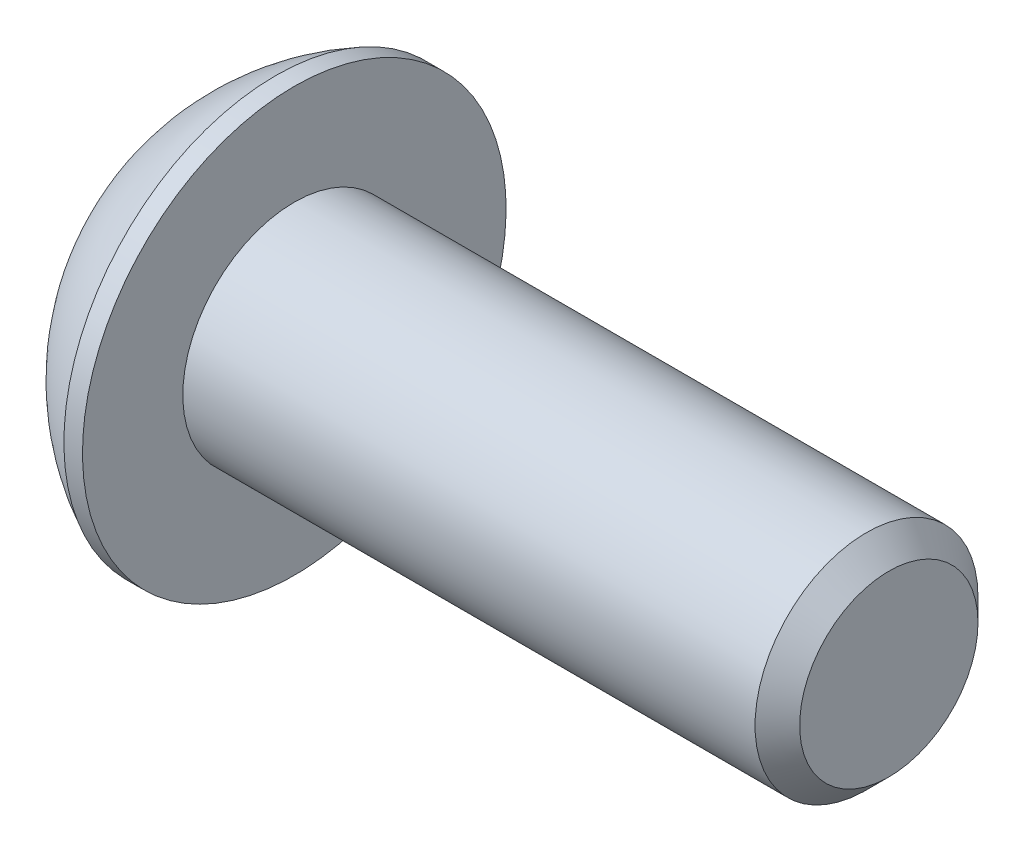
ISO-10303-21;
HEADER;
FILE_DESCRIPTION(('STEP AP214'),'2;1');
FILE_NAME('part.step','',(''),(''),'','','');
FILE_SCHEMA(('AUTOMOTIVE_DESIGN { 1 0 10303 214 1 1 1 1 }'));
ENDSEC;
DATA;
#1=APPLICATION_CONTEXT('core data for automotive mechanical design processes');
#2=APPLICATION_PROTOCOL_DEFINITION('international standard','automotive_design',2000,#1);
#3=PRODUCT_CONTEXT('',#1,'mechanical');
#4=PRODUCT('Part','Part','',(#3));
#5=PRODUCT_RELATED_PRODUCT_CATEGORY('part','',(#4));
#6=PRODUCT_DEFINITION_FORMATION('','',#4);
#7=PRODUCT_DEFINITION_CONTEXT('part definition',#1,'design');
#8=PRODUCT_DEFINITION('design','',#6,#7);
#9=PRODUCT_DEFINITION_SHAPE('','',#8);
#10=(LENGTH_UNIT() NAMED_UNIT(*) SI_UNIT(.MILLI.,.METRE.));
#11=(NAMED_UNIT(*) PLANE_ANGLE_UNIT() SI_UNIT($,.RADIAN.));
#12=(NAMED_UNIT(*) SI_UNIT($,.STERADIAN.) SOLID_ANGLE_UNIT());
#13=UNCERTAINTY_MEASURE_WITH_UNIT(LENGTH_MEASURE(1.E-05),#10,'distance_accuracy_value','');
#14=(GEOMETRIC_REPRESENTATION_CONTEXT(3) GLOBAL_UNCERTAINTY_ASSIGNED_CONTEXT((#13)) GLOBAL_UNIT_ASSIGNED_CONTEXT((#10,
#11,#12)) REPRESENTATION_CONTEXT('',''));
#15=CARTESIAN_POINT('',(0.,0.,0.));
#16=DIRECTION('',(0.,0.,1.));
#17=DIRECTION('',(1.,0.,0.));
#18=AXIS2_PLACEMENT_3D('',#15,#16,#17);
#19=CARTESIAN_POINT('',(-8.,0.,0.));
#20=DIRECTION('',(1.,0.,0.));
#21=DIRECTION('',(0.,0.,-1.));
#22=AXIS2_PLACEMENT_3D('',#19,#20,#21);
#23=CYLINDRICAL_SURFACE('',#22,1.5);
#24=CARTESIAN_POINT('',(-0.3,0.,0.));
#25=DIRECTION('',(1.,0.,0.));
#26=DIRECTION('',(0.,0.,-1.));
#27=AXIS2_PLACEMENT_3D('',#24,#25,#26);
#28=CIRCLE('',#27,1.5);
#29=CARTESIAN_POINT('',(-0.3,0.,-1.5));
#30=VERTEX_POINT('',#29);
#31=EDGE_CURVE('E47',#30,#30,#28,.F.);
#32=ORIENTED_EDGE('',*,*,#31,.T.);
#33=EDGE_LOOP('',(#32));
#34=FACE_BOUND('',#33,.T.);
#35=CARTESIAN_POINT('',(-8.,0.,0.));
#36=DIRECTION('',(1.,0.,0.));
#37=DIRECTION('',(0.,1.,0.));
#38=AXIS2_PLACEMENT_3D('',#35,#36,#37);
#39=CIRCLE('',#38,1.5);
#40=CARTESIAN_POINT('',(-8.,1.49999999999999,0.));
#41=VERTEX_POINT('',#40);
#42=EDGE_CURVE('E126',#41,#41,#39,.F.);
#43=ORIENTED_EDGE('',*,*,#42,.F.);
#44=EDGE_LOOP('',(#43));
#45=FACE_BOUND('',#44,.T.);
#46=ADVANCED_FACE('F33',(#34,#45),#23,.T.);
#47=CARTESIAN_POINT('',(0.,0.,0.));
#48=DIRECTION('',(1.,0.,0.));
#49=DIRECTION('',(0.,0.,-1.));
#50=AXIS2_PLACEMENT_3D('',#47,#48,#49);
#51=PLANE('',#50);
#52=CARTESIAN_POINT('',(0.,0.,0.));
#53=DIRECTION('',(1.,0.,0.));
#54=DIRECTION('',(0.,0.,-1.));
#55=AXIS2_PLACEMENT_3D('',#52,#53,#54);
#56=CIRCLE('',#55,1.2);
#57=CARTESIAN_POINT('',(0.,0.,-1.2));
#58=VERTEX_POINT('',#57);
#59=EDGE_CURVE('E129',#58,#58,#56,.T.);
#60=ORIENTED_EDGE('',*,*,#59,.T.);
#61=EDGE_LOOP('',(#60));
#62=FACE_BOUND('',#61,.T.);
#63=ADVANCED_FACE('F139',(#62),#51,.T.);
#64=CARTESIAN_POINT('',(0.,0.,0.));
#65=DIRECTION('',(-1.,0.,0.));
#66=DIRECTION('',(0.,0.,1.));
#67=AXIS2_PLACEMENT_3D('',#64,#65,#66);
#68=CONICAL_SURFACE('',#67,1.2,0.785398163397447);
#69=ORIENTED_EDGE('',*,*,#31,.F.);
#70=EDGE_LOOP('',(#69));
#71=FACE_BOUND('',#70,.T.);
#72=ORIENTED_EDGE('',*,*,#59,.F.);
#73=EDGE_LOOP('',(#72));
#74=FACE_BOUND('',#73,.T.);
#75=ADVANCED_FACE('F35',(#71,#74),#68,.T.);
#76=CARTESIAN_POINT('',(-9.65,0.,0.));
#77=DIRECTION('',(-1.,0.,0.));
#78=DIRECTION('',(0.,-1.,0.));
#79=AXIS2_PLACEMENT_3D('',#76,#77,#78);
#80=PLANE('',#79);
#81=CARTESIAN_POINT('',(-9.65,0.,0.));
#82=DIRECTION('',(-1.,0.,0.));
#83=DIRECTION('',(0.,-1.,0.));
#84=AXIS2_PLACEMENT_3D('',#81,#82,#83);
#85=CIRCLE('',#84,1.20470053837925);
#86=CARTESIAN_POINT('',(-9.65,-1.20470053837926,0.));
#87=VERTEX_POINT('',#86);
#88=EDGE_CURVE('E248',#87,#87,#85,.T.);
#89=ORIENTED_EDGE('',*,*,#88,.F.);
#90=EDGE_LOOP('',(#89));
#91=FACE_BOUND('',#90,.T.);
#92=CARTESIAN_POINT('',(-9.65,0.,0.));
#93=DIRECTION('',(1.,0.,0.));
#94=DIRECTION('',(0.,1.,0.));
#95=AXIS2_PLACEMENT_3D('',#92,#93,#94);
#96=CIRCLE('',#95,1.5);
#97=CARTESIAN_POINT('',(-9.65,1.5,0.));
#98=VERTEX_POINT('',#97);
#99=EDGE_CURVE('E123',#98,#98,#96,.T.);
#100=ORIENTED_EDGE('',*,*,#99,.F.);
#101=EDGE_LOOP('',(#100));
#102=FACE_BOUND('',#101,.T.);
#103=ADVANCED_FACE('F138',(#91,#102),#80,.T.);
#104=CARTESIAN_POINT('',(-6.85267857142857,0.,0.));
#105=DIRECTION('',(1.,0.,0.));
#106=DIRECTION('',(0.,1.,0.));
#107=AXIS2_PLACEMENT_3D('',#104,#105,#106);
#108=SPHERICAL_SURFACE('',#107,3.17411517981703);
#109=CARTESIAN_POINT('',(-8.25,0.,0.));
#110=DIRECTION('',(1.,0.,0.));
#111=DIRECTION('',(0.,1.,0.));
#112=AXIS2_PLACEMENT_3D('',#109,#110,#111);
#113=CIRCLE('',#112,2.85);
#114=CARTESIAN_POINT('',(-8.25,2.85,0.));
#115=VERTEX_POINT('',#114);
#116=EDGE_CURVE('E120',#115,#115,#113,.T.);
#117=CARTESIAN_POINT('',(-9.65,1.5,0.));
#118=CARTESIAN_POINT('',(-9.64026970175371,1.51814590550861,0.));
#119=CARTESIAN_POINT('',(-9.63036279141013,1.53619710575443,0.));
#120=CARTESIAN_POINT('',(-9.61019960266953,1.57210331824231,0.));
#121=CARTESIAN_POINT('',(-9.59994332427251,1.58995833048437,0.));
#122=CARTESIAN_POINT('',(-9.57908525556619,1.62546538948657,0.));
#123=CARTESIAN_POINT('',(-9.56848346525689,1.64311743624671,0.));
#124=CARTESIAN_POINT('',(-9.54693839516577,1.67821188357876,0.));
#125=CARTESIAN_POINT('',(-9.53599511538396,1.69565428415069,0.));
#126=CARTESIAN_POINT('',(-9.51377120861204,1.73032283245973,0.));
#127=CARTESIAN_POINT('',(-9.50249058162193,1.74754898019686,0.));
#128=CARTESIAN_POINT('',(-9.47959625299793,1.78177849951501,0.));
#129=CARTESIAN_POINT('',(-9.46798255136403,1.79878187109604,0.));
#130=CARTESIAN_POINT('',(-9.44442647147186,1.8325593987641,0.));
#131=CARTESIAN_POINT('',(-9.4324840932136,1.84933355485112,0.));
#132=CARTESIAN_POINT('',(-9.40827518274626,1.88264629910089,0.));
#133=CARTESIAN_POINT('',(-9.39600865053719,1.89918488726362,0.));
#134=CARTESIAN_POINT('',(-9.37115607755147,1.93202023241769,0.));
#135=CARTESIAN_POINT('',(-9.35857003677481,1.94831698940902,0.));
#136=CARTESIAN_POINT('',(-9.33308321304966,1.98066250056315,0.));
#137=CARTESIAN_POINT('',(-9.32018243010117,1.99671125472595,0.));
#138=CARTESIAN_POINT('',(-9.29407100761891,2.02855468248373,0.));
#139=CARTESIAN_POINT('',(-9.28086036808515,2.04434935607872,0.));
#140=CARTESIAN_POINT('',(-9.25413423536401,2.07567864118366,0.));
#141=CARTESIAN_POINT('',(-9.24061874217664,2.09121325269361,0.));
#142=CARTESIAN_POINT('',(-9.21328802052923,2.12201653059784,0.));
#143=CARTESIAN_POINT('',(-9.19947279206918,2.13728519699211,0.));
#144=CARTESIAN_POINT('',(-9.17154783176855,2.16755080234906,0.));
#145=CARTESIAN_POINT('',(-9.15743809992798,2.18254774131173,0.));
#146=CARTESIAN_POINT('',(-9.12892947628826,2.21226421239399,0.));
#147=CARTESIAN_POINT('',(-9.11453058448912,2.22698374451358,0.));
#148=CARTESIAN_POINT('',(-9.08544909386046,2.25613982755347,0.));
#149=CARTESIAN_POINT('',(-9.07076649503095,2.27057637847377,0.));
#150=CARTESIAN_POINT('',(-9.04112315071093,2.29916103192521,0.));
#151=CARTESIAN_POINT('',(-9.02616240522044,2.31330913445635,0.));
#152=CARTESIAN_POINT('',(-8.9959684332833,2.34131153317633,0.));
#153=CARTESIAN_POINT('',(-8.98073520683666,2.35516582936518,0.));
#154=CARTESIAN_POINT('',(-8.95000204188189,2.38257536871332,0.));
#155=CARTESIAN_POINT('',(-8.93450210337377,2.3961306118726,0.));
#156=CARTESIAN_POINT('',(-8.90324138419582,2.42293691172714,0.));
#157=CARTESIAN_POINT('',(-8.88748060352599,2.43618796842238,0.));
#158=CARTESIAN_POINT('',(-8.85570416870656,2.46238087711119,0.));
#159=CARTESIAN_POINT('',(-8.83968851455696,2.47532272910475,0.));
#160=CARTESIAN_POINT('',(-8.80740839798172,2.50089232724988,0.));
#161=CARTESIAN_POINT('',(-8.79114393555609,2.51352007340145,0.));
#162=CARTESIAN_POINT('',(-8.75837236185728,2.53845667767541,0.));
#163=CARTESIAN_POINT('',(-8.74186525058411,2.55076553579779,0.));
#164=CARTESIAN_POINT('',(-8.70861463051145,2.57505970259155,0.));
#165=CARTESIAN_POINT('',(-8.69187112171197,2.58704501126291,0.));
#166=CARTESIAN_POINT('',(-8.65815404743097,2.61068754025891,0.));
#167=CARTESIAN_POINT('',(-8.64118048194944,2.62234476058354,0.));
#168=CARTESIAN_POINT('',(-8.60700972227902,2.64532669825233,0.));
#169=CARTESIAN_POINT('',(-8.58981252809013,2.65665141559648,0.));
#170=CARTESIAN_POINT('',(-8.55520102364322,2.6789640585411,0.));
#171=CARTESIAN_POINT('',(-8.5377867133852,2.68995198414157,0.));
#172=CARTESIAN_POINT('',(-8.50274757175707,2.71158688256655,0.));
#173=CARTESIAN_POINT('',(-8.48512274038695,2.72223385539107,0.));
#174=CARTESIAN_POINT('',(-8.44966923085904,2.74318281565687,0.));
#175=CARTESIAN_POINT('',(-8.43184055270124,2.75348480309814,0.));
#176=CARTESIAN_POINT('',(-8.39598610245597,2.7737398932333,0.));
#177=CARTESIAN_POINT('',(-8.37796033036851,2.78369299592719,0.));
#178=CARTESIAN_POINT('',(-8.34171851477686,2.8032465396409,0.));
#179=CARTESIAN_POINT('',(-8.32350247127267,2.81284698066071,0.));
#180=CARTESIAN_POINT('',(-8.28688702602323,2.83169159380608,0.));
#181=CARTESIAN_POINT('',(-8.26848762427797,2.84093576593165,0.));
#182=CARTESIAN_POINT('',(-8.25,2.85,0.));
#183=B_SPLINE_CURVE_WITH_KNOTS('',3,(#117,#118,#119,#120,#121,#122,#123,#124,#125,#126,#127,
#128,#129,#130,#131,#132,#133,#134,#135,#136,#137,#138,#139,#140,#141,#142,#143,#144,#145,#146,
#147,#148,#149,#150,#151,#152,#153,#154,#155,#156,#157,#158,#159,#160,#161,#162,#163,#164,#165,
#166,#167,#168,#169,#170,#171,#172,#173,#174,#175,#176,#177,#178,#179,#180,#181,#182),
.UNSPECIFIED.,.F.,.F.,(4,2,2,2,2,2,2,2,2,2,2,2,2,2,2,2,2,2,2,2,2,2,2,2,2,2,2,2,2,2,2,2,4),(0.,
0.0617693508858094,0.12353870177162,0.185308052657429,0.247077403543238,0.308846754429048,
0.370616105314857,0.432385456200667,0.494154807086476,0.555924157972285,0.617693508858095,
0.679462859743904,0.741232210629714,0.803001561515523,0.864770912401333,0.926540263287143,
0.988309614172951,1.05007896505876,1.11184831594457,1.17361766683038,1.23538701771619,
1.297156368602,1.35892571948781,1.42069507037362,1.48246442125943,1.54423377214524,
1.60600312303105,1.66777247391686,1.72954182480267,1.79131117568847,1.85308052657428,
1.91484987746009,1.9766192283459),.UNSPECIFIED.);
#184=EDGE_CURVE('BSEAM150',#98,#115,#183,.T.);
#185=ORIENTED_EDGE('',*,*,#99,.T.);
#186=ORIENTED_EDGE('',*,*,#116,.F.);
#187=ORIENTED_EDGE('',*,*,#184,.T.);
#188=ORIENTED_EDGE('',*,*,#184,.F.);
#189=EDGE_LOOP('',(#185,#187,#186,#188));
#190=FACE_BOUND('',#189,.T.);
#191=ADVANCED_FACE('F150',(#190),#108,.T.);
#192=CARTESIAN_POINT('',(-8.,0.,0.));
#193=DIRECTION('',(1.,0.,0.));
#194=DIRECTION('',(0.,1.,0.));
#195=AXIS2_PLACEMENT_3D('',#192,#193,#194);
#196=CYLINDRICAL_SURFACE('',#195,2.85);
#197=ORIENTED_EDGE('',*,*,#116,.T.);
#198=EDGE_LOOP('',(#197));
#199=FACE_BOUND('',#198,.T.);
#200=CARTESIAN_POINT('',(-8.,0.,0.));
#201=DIRECTION('',(1.,0.,0.));
#202=DIRECTION('',(0.,1.,0.));
#203=AXIS2_PLACEMENT_3D('',#200,#201,#202);
#204=CIRCLE('',#203,2.85);
#205=CARTESIAN_POINT('',(-8.,2.85,0.));
#206=VERTEX_POINT('',#205);
#207=EDGE_CURVE('E117',#206,#206,#204,.T.);
#208=ORIENTED_EDGE('',*,*,#207,.F.);
#209=EDGE_LOOP('',(#208));
#210=FACE_BOUND('',#209,.T.);
#211=ADVANCED_FACE('F154',(#199,#210),#196,.T.);
#212=CARTESIAN_POINT('',(-8.,2.85,0.));
#213=DIRECTION('',(1.,0.,0.));
#214=DIRECTION('',(0.,1.,0.));
#215=AXIS2_PLACEMENT_3D('',#212,#213,#214);
#216=PLANE('',#215);
#217=ORIENTED_EDGE('',*,*,#42,.T.);
#218=EDGE_LOOP('',(#217));
#219=FACE_BOUND('',#218,.T.);
#220=ORIENTED_EDGE('',*,*,#207,.T.);
#221=EDGE_LOOP('',(#220));
#222=FACE_BOUND('',#221,.T.);
#223=ADVANCED_FACE('F158',(#219,#222),#216,.T.);
#224=CARTESIAN_POINT('',(-9.65,0.,0.));
#225=DIRECTION('',(-1.,0.,0.));
#226=DIRECTION('',(0.,-1.,0.));
#227=AXIS2_PLACEMENT_3D('',#224,#225,#226);
#228=CONICAL_SURFACE('',#227,1.20470053837925,0.78539816339745);
#229=ORIENTED_EDGE('',*,*,#88,.T.);
#230=EDGE_LOOP('',(#229));
#231=FACE_BOUND('',#230,.T.);
#232=CARTESIAN_POINT('',(-10.0125645579163,-1.20678079288096,1.));
#233=CARTESIAN_POINT('',(-9.99012387997521,-1.17763239380938,1.));
#234=CARTESIAN_POINT('',(-9.96788676092706,-1.14832777655038,1.));
#235=CARTESIAN_POINT('',(-9.92390532308587,-1.0893407399734,1.));
#236=CARTESIAN_POINT('',(-9.90216112088704,-1.05965823380996,1.));
#237=CARTESIAN_POINT('',(-9.83748588022217,-0.969511619364379,1.));
#238=CARTESIAN_POINT('',(-9.79545644276499,-0.908390032886409,1.));
#239=CARTESIAN_POINT('',(-9.71242033491188,-0.779849899214034,1.));
#240=CARTESIAN_POINT('',(-9.67164849568708,-0.712278047733962,1.));
#241=CARTESIAN_POINT('',(-9.59670568554025,-0.573692441836179,1.));
#242=CARTESIAN_POINT('',(-9.56251242080363,-0.502691370033591,1.));
#243=CARTESIAN_POINT('',(-9.52066482404941,-0.396633108483669,1.));
#244=CARTESIAN_POINT('',(-9.50875242460105,-0.363265114723096,1.));
#245=CARTESIAN_POINT('',(-9.48760105808146,-0.295675144863693,1.));
#246=CARTESIAN_POINT('',(-9.47836226085427,-0.261453114661033,1.));
#247=CARTESIAN_POINT('',(-9.46321083759311,-0.192964714439427,1.));
#248=CARTESIAN_POINT('',(-9.45723720793528,-0.158712062702431,1.));
#249=CARTESIAN_POINT('',(-9.44873817928594,-0.0897678989597888,1.));
#250=CARTESIAN_POINT('',(-9.44621316916075,-0.0550763379077905,1.));
#251=CARTESIAN_POINT('',(-9.44483082423944,0.0128534343372017,1.));
#252=CARTESIAN_POINT('',(-9.44581713334252,0.0460884918414669,1.));
#253=CARTESIAN_POINT('',(-9.45104282964632,0.112288777523354,1.));
#254=CARTESIAN_POINT('',(-9.45528142282844,0.145254069576927,1.));
#255=CARTESIAN_POINT('',(-9.46684319323882,0.211252641710473,1.));
#256=CARTESIAN_POINT('',(-9.47422139919693,0.244276126106416,1.));
#257=CARTESIAN_POINT('',(-9.49165376330127,0.309593416178906,1.));
#258=CARTESIAN_POINT('',(-9.50170777209373,0.341887262472136,1.));
#259=CARTESIAN_POINT('',(-9.53646926761079,0.441188556116714,1.));
#260=CARTESIAN_POINT('',(-9.56503436033369,0.506841480843487,1.));
#261=CARTESIAN_POINT('',(-9.62860336942529,0.635081389212373,1.));
#262=CARTESIAN_POINT('',(-9.66362995530904,0.697656564069532,1.));
#263=CARTESIAN_POINT('',(-9.73595461078913,0.817274369694621,1.));
#264=CARTESIAN_POINT('',(-9.77305561629113,0.87443767231359,1.));
#265=CARTESIAN_POINT('',(-9.8304371678966,0.958655710303493,1.));
#266=CARTESIAN_POINT('',(-9.84977201892494,0.986366163766959,1.));
#267=CARTESIAN_POINT('',(-9.88896027138788,1.0414069197441,1.));
#268=CARTESIAN_POINT('',(-9.90881352920099,1.06873732439882,1.));
#269=CARTESIAN_POINT('',(-9.92888195229002,1.0959092145887,1.));
#270=B_SPLINE_CURVE_WITH_KNOTS('',3,(#232,#233,#234,#235,#236,#237,#238,#239,#240,#241,#242,
#243,#244,#245,#246,#247,#248,#249,#250,#251,#252,#253,#254,#255,#256,#257,#258,#259,#260,#261,
#262,#263,#264,#265,#266,#267,#268,#269),.UNSPECIFIED.,.F.,.F.,(4,2,2,2,2,2,2,2,2,2,2,2,2,2,2,2,
2,2,4),(0.,0.110355487284534,0.220736811203826,0.443178348562911,0.679759335181115,
0.915523888816463,1.02172703810024,1.1279369325962,1.23208803653002,1.33625088357217,
1.43583459192535,1.53539399546241,1.63677534642523,1.73815103982916,1.95232008261278,
2.16725532249797,2.37159620059983,2.47295962852456,2.57429526618464),.UNSPECIFIED.);
#271=CARTESIAN_POINT('',(-9.6,-0.57735026918963,1.));
#272=VERTEX_POINT('',#271);
#273=CARTESIAN_POINT('',(-9.6,0.577350269189622,1.));
#274=VERTEX_POINT('',#273);
#275=EDGE_CURVE('E101',#272,#274,#270,.T.);
#276=ORIENTED_EDGE('',*,*,#275,.F.);
#277=CARTESIAN_POINT('',(-9.60011548737261,-1.15481600843309,-0.000200000000000086));
#278=CARTESIAN_POINT('',(-9.58027793082573,-1.13496520795026,0.0341825950071806));
#279=CARTESIAN_POINT('',(-9.56160502063889,-1.11478247255943,0.0691401181398246));
#280=CARTESIAN_POINT('',(-9.52741474272316,-1.0736273952922,0.140422802956089));
#281=CARTESIAN_POINT('',(-9.51191640902346,-1.0526511355808,0.176754750528983));
#282=CARTESIAN_POINT('',(-9.48536730714227,-1.01035337909804,0.25001661380331));
#283=CARTESIAN_POINT('',(-9.47424977399693,-0.989042666109245,0.286927851445414));
#284=CARTESIAN_POINT('',(-9.45711986577618,-0.945952199282696,0.361562729310858));
#285=CARTESIAN_POINT('',(-9.45109469746667,-0.924173762626601,0.399284088108635));
#286=CARTESIAN_POINT('',(-9.4456605549675,-0.88664131264002,0.464292198417933));
#287=CARTESIAN_POINT('',(-9.44485693831673,-0.87093613067228,0.491494371528171));
#288=CARTESIAN_POINT('',(-9.44620669941689,-0.839556179862853,0.545846040669111));
#289=CARTESIAN_POINT('',(-9.4483607295472,-0.823881418494929,0.572995523754875));
#290=CARTESIAN_POINT('',(-9.45911697212847,-0.777080970599371,0.654056277326959));
#291=CARTESIAN_POINT('',(-9.47201455641536,-0.746188191116435,0.707564140978427));
#292=CARTESIAN_POINT('',(-9.50314073060218,-0.691968116419654,0.801476065143431));
#293=CARTESIAN_POINT('',(-9.51973779770184,-0.668386557293377,0.842320523671833));
#294=CARTESIAN_POINT('',(-9.55712492468529,-0.622147085933687,0.922409637381943));
#295=CARTESIAN_POINT('',(-9.5779013418174,-0.59948644958458,0.961659010870437));
#296=CARTESIAN_POINT('',(-9.60011548737261,-0.577234799135793,1.0002));
#297=B_SPLINE_CURVE_WITH_KNOTS('',3,(#277,#278,#279,#280,#281,#282,#283,#284,#285,#286,#287,
#288,#289,#290,#291,#292,#293,#294,#295,#296),.UNSPECIFIED.,.F.,.F.,(4,2,2,2,2,2,2,2,2,4),(0.,
0.133237676828559,0.267252229834489,0.399137076269299,0.530689603280767,0.624814864263845,
0.718960890149132,0.907306626112096,1.05710100361789,1.20641411519286),.UNSPECIFIED.);
#298=CARTESIAN_POINT('',(-9.6,-1.15470053837926,0.));
#299=VERTEX_POINT('',#298);
#300=EDGE_CURVE('E204',#299,#272,#297,.T.);
#301=ORIENTED_EDGE('',*,*,#300,.F.);
#302=CARTESIAN_POINT('',(-9.60011548737261,-0.577234799135792,-1.0002));
#303=CARTESIAN_POINT('',(-9.58027793082573,-0.597085599618626,-0.965817404992819));
#304=CARTESIAN_POINT('',(-9.56160502063889,-0.617268335009461,-0.930859881860175));
#305=CARTESIAN_POINT('',(-9.52741474272316,-0.65842341227669,-0.859577197043911));
#306=CARTESIAN_POINT('',(-9.51191640902346,-0.679399671988084,-0.823245249471017));
#307=CARTESIAN_POINT('',(-9.48536730714227,-0.72169742847085,-0.74998338619669));
#308=CARTESIAN_POINT('',(-9.47424977399693,-0.743008141459641,-0.713072148554586));
#309=CARTESIAN_POINT('',(-9.45711986577618,-0.78609860828619,-0.638437270689141));
#310=CARTESIAN_POINT('',(-9.45109469746667,-0.807877044942285,-0.600715911891365));
#311=CARTESIAN_POINT('',(-9.4456605549675,-0.845409494928867,-0.535707801582067));
#312=CARTESIAN_POINT('',(-9.44485693831673,-0.861114676896606,-0.508505628471828));
#313=CARTESIAN_POINT('',(-9.44620669941689,-0.892494627706033,-0.454153959330889));
#314=CARTESIAN_POINT('',(-9.4483607295472,-0.908169389073958,-0.427004476245125));
#315=CARTESIAN_POINT('',(-9.45911697212847,-0.954969836969515,-0.34594372267304));
#316=CARTESIAN_POINT('',(-9.47201455641536,-0.985862616452451,-0.292435859021573));
#317=CARTESIAN_POINT('',(-9.50314073060218,-1.04008269114923,-0.198523934856569));
#318=CARTESIAN_POINT('',(-9.51973779770184,-1.06366425027551,-0.157679476328166));
#319=CARTESIAN_POINT('',(-9.55712492468529,-1.1099037216352,-0.0775903626180569));
#320=CARTESIAN_POINT('',(-9.5779013418174,-1.13256435798431,-0.0383409891295627));
#321=CARTESIAN_POINT('',(-9.60011548737261,-1.15481600843309,0.000199999999999825));
#322=B_SPLINE_CURVE_WITH_KNOTS('',3,(#302,#303,#304,#305,#306,#307,#308,#309,#310,#311,#312,
#313,#314,#315,#316,#317,#318,#319,#320,#321),.UNSPECIFIED.,.F.,.F.,(4,2,2,2,2,2,2,2,2,4),(0.,
0.133237676828559,0.267252229834489,0.399137076269299,0.530689603280767,0.624814864263845,
0.718960890149132,0.907306626112096,1.05710100361789,1.20641411519286),.UNSPECIFIED.);
#323=CARTESIAN_POINT('',(-9.6,-0.57735026918963,-1.));
#324=VERTEX_POINT('',#323);
#325=EDGE_CURVE('E198',#324,#299,#322,.T.);
#326=ORIENTED_EDGE('',*,*,#325,.F.);
#327=CARTESIAN_POINT('',(-10.0125645579163,-1.20678079288096,-1.));
#328=CARTESIAN_POINT('',(-9.99012387997521,-1.17763239380938,-1.));
#329=CARTESIAN_POINT('',(-9.96788676092706,-1.14832777655038,-1.));
#330=CARTESIAN_POINT('',(-9.92390532308587,-1.0893407399734,-1.));
#331=CARTESIAN_POINT('',(-9.90216112088704,-1.05965823380996,-1.));
#332=CARTESIAN_POINT('',(-9.83748588022217,-0.969511619364378,-1.));
#333=CARTESIAN_POINT('',(-9.79545644276499,-0.908390032886409,-1.));
#334=CARTESIAN_POINT('',(-9.71242033491188,-0.779849899214033,-1.));
#335=CARTESIAN_POINT('',(-9.67164849568707,-0.71227804773396,-1.));
#336=CARTESIAN_POINT('',(-9.59670568554025,-0.573692441836177,-1.));
#337=CARTESIAN_POINT('',(-9.56251242080363,-0.50269137003359,-1.));
#338=CARTESIAN_POINT('',(-9.52066482404941,-0.396633108483668,-1.));
#339=CARTESIAN_POINT('',(-9.50875242460105,-0.363265114723096,-1.));
#340=CARTESIAN_POINT('',(-9.48760105808146,-0.295675144863693,-1.));
#341=CARTESIAN_POINT('',(-9.47836226085427,-0.261453114661032,-1.));
#342=CARTESIAN_POINT('',(-9.46321083759311,-0.192964714439427,-1.));
#343=CARTESIAN_POINT('',(-9.45723720793528,-0.158712062702431,-1.));
#344=CARTESIAN_POINT('',(-9.44873817928594,-0.089767898959789,-1.));
#345=CARTESIAN_POINT('',(-9.44621316916075,-0.0550763379077907,-1.));
#346=CARTESIAN_POINT('',(-9.44483082423944,0.0128534343372015,-1.));
#347=CARTESIAN_POINT('',(-9.44581713334252,0.0460884918414669,-1.));
#348=CARTESIAN_POINT('',(-9.45104282964632,0.112288777523355,-1.));
#349=CARTESIAN_POINT('',(-9.45528142282844,0.145254069576927,-1.));
#350=CARTESIAN_POINT('',(-9.46684319323882,0.211252641710473,-1.));
#351=CARTESIAN_POINT('',(-9.47422139919693,0.244276126106416,-1.));
#352=CARTESIAN_POINT('',(-9.49165376330127,0.309593416178906,-1.));
#353=CARTESIAN_POINT('',(-9.50170777209373,0.341887262472136,-1.));
#354=CARTESIAN_POINT('',(-9.53646926761078,0.441188556116715,-1.));
#355=CARTESIAN_POINT('',(-9.56503436033369,0.506841480843487,-1.));
#356=CARTESIAN_POINT('',(-9.62860336942529,0.635081389212373,-1.));
#357=CARTESIAN_POINT('',(-9.66362995530904,0.697656564069532,-1.));
#358=CARTESIAN_POINT('',(-9.73595461078913,0.817274369694622,-1.));
#359=CARTESIAN_POINT('',(-9.77305561629113,0.874437672313591,-1.));
#360=CARTESIAN_POINT('',(-9.8304371678966,0.958655710303494,-1.));
#361=CARTESIAN_POINT('',(-9.84977201892494,0.98636616376696,-1.));
#362=CARTESIAN_POINT('',(-9.88896027138788,1.0414069197441,-1.));
#363=CARTESIAN_POINT('',(-9.90881352920099,1.06873732439882,-1.));
#364=CARTESIAN_POINT('',(-9.92888195229002,1.0959092145887,-1.));
#365=B_SPLINE_CURVE_WITH_KNOTS('',3,(#327,#328,#329,#330,#331,#332,#333,#334,#335,#336,#337,
#338,#339,#340,#341,#342,#343,#344,#345,#346,#347,#348,#349,#350,#351,#352,#353,#354,#355,#356,
#357,#358,#359,#360,#361,#362,#363,#364),.UNSPECIFIED.,.F.,.F.,(4,2,2,2,2,2,2,2,2,2,2,2,2,2,2,2,
2,2,4),(0.,0.110355487284534,0.220736811203828,0.443178348562912,0.679759335181118,
0.915523888816463,1.02172703810024,1.1279369325962,1.23208803653002,1.33625088357217,
1.43583459192535,1.53539399546241,1.63677534642524,1.73815103982916,1.95232008261278,
2.16725532249797,2.37159620059983,2.47295962852456,2.57429526618464),.UNSPECIFIED.);
#366=CARTESIAN_POINT('',(-9.6,0.577350269189622,-1.));
#367=VERTEX_POINT('',#366);
#368=EDGE_CURVE('E54',#367,#324,#365,.F.);
#369=ORIENTED_EDGE('',*,*,#368,.F.);
#370=CARTESIAN_POINT('',(-9.60011548737261,1.15481600843309,0.000199999999999967));
#371=CARTESIAN_POINT('',(-9.58027793082573,1.13496520795025,-0.0341825950071811));
#372=CARTESIAN_POINT('',(-9.56160502063889,1.11478247255942,-0.0691401181398254));
#373=CARTESIAN_POINT('',(-9.52741474272316,1.07362739529219,-0.14042280295609));
#374=CARTESIAN_POINT('',(-9.51191640902346,1.05265113558079,-0.176754750528985));
#375=CARTESIAN_POINT('',(-9.48536730714226,1.01035337909803,-0.250016613803312));
#376=CARTESIAN_POINT('',(-9.47424977399693,0.989042666109236,-0.286927851445416));
#377=CARTESIAN_POINT('',(-9.45711986577618,0.945952199282687,-0.361562729310861));
#378=CARTESIAN_POINT('',(-9.45109469746667,0.924173762626592,-0.399284088108637));
#379=CARTESIAN_POINT('',(-9.44566055496749,0.88664131264001,-0.464292198417935));
#380=CARTESIAN_POINT('',(-9.44485693831673,0.870936130672271,-0.491494371528174));
#381=CARTESIAN_POINT('',(-9.44620669941689,0.839556179862844,-0.545846040669113));
#382=CARTESIAN_POINT('',(-9.4483607295472,0.823881418494919,-0.572995523754877));
#383=CARTESIAN_POINT('',(-9.45911697212847,0.777080970599362,-0.654056277326962));
#384=CARTESIAN_POINT('',(-9.47201455641536,0.746188191116425,-0.707564140978429));
#385=CARTESIAN_POINT('',(-9.50314073060218,0.691968116419645,-0.801476065143433));
#386=CARTESIAN_POINT('',(-9.51973779770184,0.668386557293367,-0.842320523671835));
#387=CARTESIAN_POINT('',(-9.55712492468529,0.622147085933677,-0.922409637381944));
#388=CARTESIAN_POINT('',(-9.5779013418174,0.599486449584571,-0.961659010870438));
#389=CARTESIAN_POINT('',(-9.60011548737261,0.577234799135784,-1.0002));
#390=B_SPLINE_CURVE_WITH_KNOTS('',3,(#370,#371,#372,#373,#374,#375,#376,#377,#378,#379,#380,
#381,#382,#383,#384,#385,#386,#387,#388,#389),.UNSPECIFIED.,.F.,.F.,(4,2,2,2,2,2,2,2,2,4),(0.,
0.13323767682856,0.267252229834491,0.399137076269302,0.53068960328077,0.624814864263848,
0.718960890149135,0.9073066261121,1.05710100361789,1.20641411519286),.UNSPECIFIED.);
#391=CARTESIAN_POINT('',(-9.6,1.15470053837925,0.));
#392=VERTEX_POINT('',#391);
#393=EDGE_CURVE('E11',#392,#367,#390,.T.);
#394=ORIENTED_EDGE('',*,*,#393,.F.);
#395=CARTESIAN_POINT('',(-9.60011548737261,0.577234799135784,1.0002));
#396=CARTESIAN_POINT('',(-9.58027793082573,0.597085599618618,0.965817404992819));
#397=CARTESIAN_POINT('',(-9.56160502063889,0.617268335009453,0.930859881860175));
#398=CARTESIAN_POINT('',(-9.52741474272316,0.658423412276682,0.859577197043911));
#399=CARTESIAN_POINT('',(-9.51191640902346,0.679399671988076,0.823245249471017));
#400=CARTESIAN_POINT('',(-9.48536730714227,0.721697428470842,0.74998338619669));
#401=CARTESIAN_POINT('',(-9.47424977399693,0.743008141459632,0.713072148554586));
#402=CARTESIAN_POINT('',(-9.45711986577618,0.786098608286182,0.638437270689142));
#403=CARTESIAN_POINT('',(-9.45109469746667,0.807877044942277,0.600715911891365));
#404=CARTESIAN_POINT('',(-9.4456605549675,0.845409494928858,0.535707801582068));
#405=CARTESIAN_POINT('',(-9.44485693831673,0.861114676896597,0.508505628471829));
#406=CARTESIAN_POINT('',(-9.44620669941689,0.892494627706025,0.454153959330889));
#407=CARTESIAN_POINT('',(-9.4483607295472,0.908169389073949,0.427004476245126));
#408=CARTESIAN_POINT('',(-9.45911697212847,0.954969836969506,0.345943722673041));
#409=CARTESIAN_POINT('',(-9.47201455641536,0.985862616452443,0.292435859021574));
#410=CARTESIAN_POINT('',(-9.50314073060218,1.04008269114922,0.19852393485657));
#411=CARTESIAN_POINT('',(-9.51973779770184,1.0636642502755,0.157679476328167));
#412=CARTESIAN_POINT('',(-9.55712492468529,1.10990372163519,0.0775903626180576));
#413=CARTESIAN_POINT('',(-9.5779013418174,1.1325643579843,0.0383409891295633));
#414=CARTESIAN_POINT('',(-9.60011548737261,1.15481600843309,-0.000199999999999447));
#415=B_SPLINE_CURVE_WITH_KNOTS('',3,(#395,#396,#397,#398,#399,#400,#401,#402,#403,#404,#405,
#406,#407,#408,#409,#410,#411,#412,#413,#414),.UNSPECIFIED.,.F.,.F.,(4,2,2,2,2,2,2,2,2,4),(0.,
0.133237676828558,0.267252229834489,0.399137076269298,0.530689603280766,0.624814864263844,
0.718960890149131,0.907306626112095,1.05710100361789,1.20641411519286),.UNSPECIFIED.);
#416=EDGE_CURVE('E92',#274,#392,#415,.T.);
#417=ORIENTED_EDGE('',*,*,#416,.F.);
#418=EDGE_LOOP('',(#276,#301,#326,#369,#394,#417));
#419=FACE_BOUND('',#418,.T.);
#420=ADVANCED_FACE('F91',(#231,#419),#228,.F.);
#421=CARTESIAN_POINT('',(-8.45,0.,0.));
#422=DIRECTION('',(-1.,0.,0.));
#423=DIRECTION('',(0.,0.,1.));
#424=AXIS2_PLACEMENT_3D('',#421,#422,#423);
#425=PLANE('',#424);
#426=DIRECTION('',(0.,0.5,-0.866025403784439));
#427=VECTOR('',#426,1.);
#428=CARTESIAN_POINT('',(-8.45,0.577350269189622,1.));
#429=LINE('',#428,#427);
#430=CARTESIAN_POINT('',(-8.45,0.577350269189622,1.));
#431=VERTEX_POINT('',#430);
#432=CARTESIAN_POINT('',(-8.45,1.15470053837925,0.));
#433=VERTEX_POINT('',#432);
#434=EDGE_CURVE('E100',#431,#433,#429,.T.);
#435=ORIENTED_EDGE('',*,*,#434,.T.);
#436=DIRECTION('',(0.,-0.5,-0.866025403784439));
#437=VECTOR('',#436,1.);
#438=CARTESIAN_POINT('',(-8.45,1.15470053837925,0.));
#439=LINE('',#438,#437);
#440=CARTESIAN_POINT('',(-8.45,0.577350269189622,-1.));
#441=VERTEX_POINT('',#440);
#442=EDGE_CURVE('E105',#433,#441,#439,.T.);
#443=ORIENTED_EDGE('',*,*,#442,.T.);
#444=DIRECTION('',(0.,-1.,0.));
#445=VECTOR('',#444,1.);
#446=CARTESIAN_POINT('',(-8.45,0.577350269189622,-1.));
#447=LINE('',#446,#445);
#448=CARTESIAN_POINT('',(-8.45,-0.57735026918963,-1.));
#449=VERTEX_POINT('',#448);
#450=EDGE_CURVE('E230',#441,#449,#447,.T.);
#451=ORIENTED_EDGE('',*,*,#450,.T.);
#452=DIRECTION('',(0.,-0.5,0.866025403784439));
#453=VECTOR('',#452,1.);
#454=CARTESIAN_POINT('',(-8.45,-0.57735026918963,-1.));
#455=LINE('',#454,#453);
#456=CARTESIAN_POINT('',(-8.45,-1.15470053837926,0.));
#457=VERTEX_POINT('',#456);
#458=EDGE_CURVE('E234',#449,#457,#455,.T.);
#459=ORIENTED_EDGE('',*,*,#458,.T.);
#460=DIRECTION('',(0.,0.5,0.866025403784439));
#461=VECTOR('',#460,1.);
#462=CARTESIAN_POINT('',(-8.45,-1.15470053837926,0.));
#463=LINE('',#462,#461);
#464=CARTESIAN_POINT('',(-8.45,-0.577350269189631,1.));
#465=VERTEX_POINT('',#464);
#466=EDGE_CURVE('E113',#457,#465,#463,.T.);
#467=ORIENTED_EDGE('',*,*,#466,.T.);
#468=DIRECTION('',(0.,1.,0.));
#469=VECTOR('',#468,1.);
#470=CARTESIAN_POINT('',(-8.45,-0.577350269189631,1.));
#471=LINE('',#470,#469);
#472=EDGE_CURVE('E108',#465,#431,#471,.T.);
#473=ORIENTED_EDGE('',*,*,#472,.T.);
#474=EDGE_LOOP('',(#435,#443,#451,#459,#467,#473));
#475=FACE_BOUND('',#474,.T.);
#476=ADVANCED_FACE('F184',(#475),#425,.T.);
#477=CARTESIAN_POINT('',(-8.45,1.15470053837925,0.));
#478=DIRECTION('',(0.,0.866025403784439,-0.5));
#479=DIRECTION('',(0.,0.5,0.866025403784439));
#480=AXIS2_PLACEMENT_3D('',#477,#478,#479);
#481=PLANE('',#480);
#482=DIRECTION('',(-1.,0.,0.));
#483=VECTOR('',#482,1.);
#484=CARTESIAN_POINT('',(-8.45,1.15470053837925,0.));
#485=LINE('',#484,#483);
#486=EDGE_CURVE('E98',#433,#392,#485,.T.);
#487=ORIENTED_EDGE('',*,*,#486,.T.);
#488=ORIENTED_EDGE('',*,*,#393,.T.);
#489=DIRECTION('',(-1.,0.,0.));
#490=VECTOR('',#489,1.);
#491=CARTESIAN_POINT('',(-8.45,0.577350269189622,-1.));
#492=LINE('',#491,#490);
#493=EDGE_CURVE('E107',#441,#367,#492,.T.);
#494=ORIENTED_EDGE('',*,*,#493,.F.);
#495=ORIENTED_EDGE('',*,*,#442,.F.);
#496=EDGE_LOOP('',(#487,#488,#494,#495));
#497=FACE_BOUND('',#496,.T.);
#498=ADVANCED_FACE('F103',(#497),#481,.F.);
#499=CARTESIAN_POINT('',(-8.45,0.577350269189622,-1.));
#500=DIRECTION('',(0.,0.,-1.));
#501=DIRECTION('',(-1.,0.,0.));
#502=AXIS2_PLACEMENT_3D('',#499,#500,#501);
#503=PLANE('',#502);
#504=ORIENTED_EDGE('',*,*,#493,.T.);
#505=ORIENTED_EDGE('',*,*,#368,.T.);
#506=DIRECTION('',(-1.,0.,0.));
#507=VECTOR('',#506,1.);
#508=CARTESIAN_POINT('',(-8.45,-0.57735026918963,-1.));
#509=LINE('',#508,#507);
#510=EDGE_CURVE('E110',#449,#324,#509,.T.);
#511=ORIENTED_EDGE('',*,*,#510,.F.);
#512=ORIENTED_EDGE('',*,*,#450,.F.);
#513=EDGE_LOOP('',(#504,#505,#511,#512));
#514=FACE_BOUND('',#513,.T.);
#515=ADVANCED_FACE('F219',(#514),#503,.F.);
#516=CARTESIAN_POINT('',(-8.45,-0.57735026918963,-1.));
#517=DIRECTION('',(0.,-0.866025403784439,-0.5));
#518=DIRECTION('',(0.,0.5,-0.866025403784439));
#519=AXIS2_PLACEMENT_3D('',#516,#517,#518);
#520=PLANE('',#519);
#521=ORIENTED_EDGE('',*,*,#510,.T.);
#522=ORIENTED_EDGE('',*,*,#325,.T.);
#523=DIRECTION('',(-1.,0.,0.));
#524=VECTOR('',#523,1.);
#525=CARTESIAN_POINT('',(-8.45,-1.15470053837926,0.));
#526=LINE('',#525,#524);
#527=EDGE_CURVE('E244',#457,#299,#526,.T.);
#528=ORIENTED_EDGE('',*,*,#527,.F.);
#529=ORIENTED_EDGE('',*,*,#458,.F.);
#530=EDGE_LOOP('',(#521,#522,#528,#529));
#531=FACE_BOUND('',#530,.T.);
#532=ADVANCED_FACE('F214',(#531),#520,.F.);
#533=CARTESIAN_POINT('',(-8.45,-1.15470053837926,0.));
#534=DIRECTION('',(0.,-0.866025403784439,0.5));
#535=DIRECTION('',(0.,-0.5,-0.866025403784439));
#536=AXIS2_PLACEMENT_3D('',#533,#534,#535);
#537=PLANE('',#536);
#538=ORIENTED_EDGE('',*,*,#527,.T.);
#539=ORIENTED_EDGE('',*,*,#300,.T.);
#540=DIRECTION('',(-1.,0.,0.));
#541=VECTOR('',#540,1.);
#542=CARTESIAN_POINT('',(-8.45,-0.577350269189631,1.));
#543=LINE('',#542,#541);
#544=EDGE_CURVE('E241',#465,#272,#543,.T.);
#545=ORIENTED_EDGE('',*,*,#544,.F.);
#546=ORIENTED_EDGE('',*,*,#466,.F.);
#547=EDGE_LOOP('',(#538,#539,#545,#546));
#548=FACE_BOUND('',#547,.T.);
#549=ADVANCED_FACE('F211',(#548),#537,.F.);
#550=CARTESIAN_POINT('',(-8.45,-0.577350269189631,1.));
#551=DIRECTION('',(0.,0.,1.));
#552=DIRECTION('',(1.,0.,0.));
#553=AXIS2_PLACEMENT_3D('',#550,#551,#552);
#554=PLANE('',#553);
#555=ORIENTED_EDGE('',*,*,#544,.T.);
#556=ORIENTED_EDGE('',*,*,#275,.T.);
#557=DIRECTION('',(-1.,0.,0.));
#558=VECTOR('',#557,1.);
#559=CARTESIAN_POINT('',(-8.45,0.577350269189622,1.));
#560=LINE('',#559,#558);
#561=EDGE_CURVE('E61',#431,#274,#560,.T.);
#562=ORIENTED_EDGE('',*,*,#561,.F.);
#563=ORIENTED_EDGE('',*,*,#472,.F.);
#564=EDGE_LOOP('',(#555,#556,#562,#563));
#565=FACE_BOUND('',#564,.T.);
#566=ADVANCED_FACE('F165',(#565),#554,.F.);
#567=CARTESIAN_POINT('',(-8.45,0.577350269189622,1.));
#568=DIRECTION('',(0.,0.866025403784439,0.5));
#569=DIRECTION('',(0.,-0.5,0.866025403784439));
#570=AXIS2_PLACEMENT_3D('',#567,#568,#569);
#571=PLANE('',#570);
#572=ORIENTED_EDGE('',*,*,#561,.T.);
#573=ORIENTED_EDGE('',*,*,#416,.T.);
#574=ORIENTED_EDGE('',*,*,#486,.F.);
#575=ORIENTED_EDGE('',*,*,#434,.F.);
#576=EDGE_LOOP('',(#572,#573,#574,#575));
#577=FACE_BOUND('',#576,.T.);
#578=ADVANCED_FACE('F97',(#577),#571,.F.);
#579=CLOSED_SHELL('',(#46,#63,#75,#103,#191,#211,#223,#420,#476,#498,#515,#532,#549,#566,#578));
#580=MANIFOLD_SOLID_BREP('B2',#579);
#581=ADVANCED_BREP_SHAPE_REPRESENTATION('',(#18,#580),#14);
#582=SHAPE_DEFINITION_REPRESENTATION(#9,#581);
ENDSEC;
END-ISO-10303-21;
